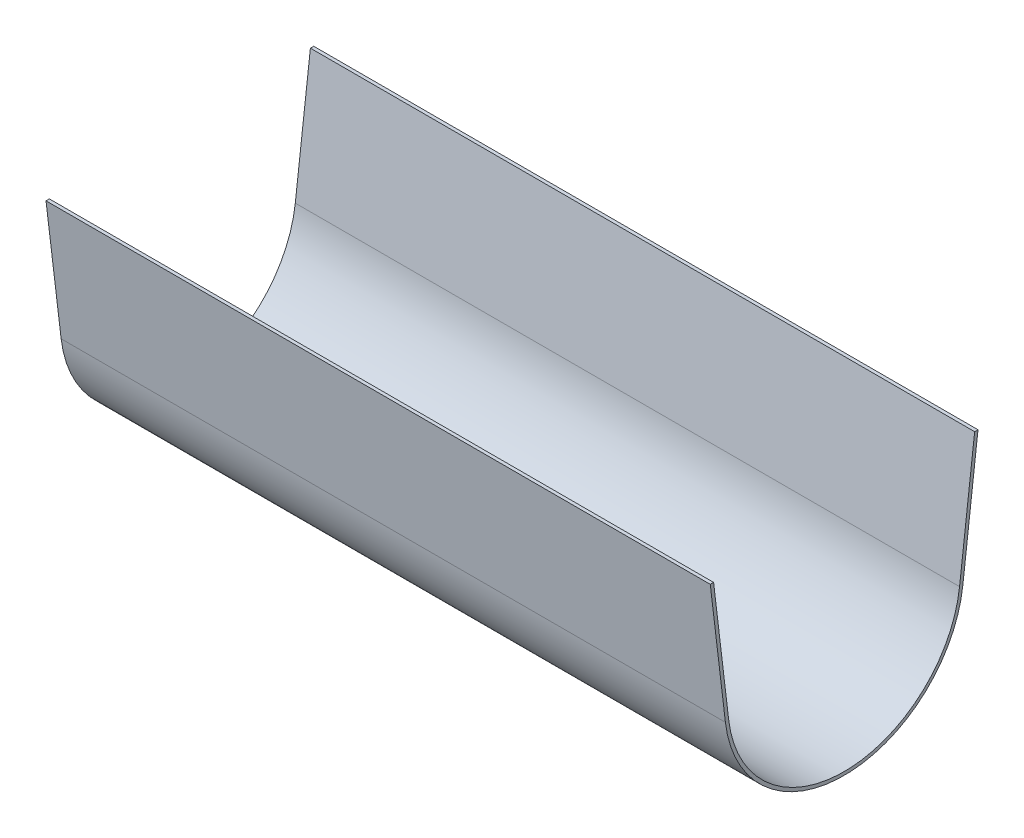
ISO-10303-21;
HEADER;
FILE_DESCRIPTION(('STEP AP214'),'2;1');
FILE_NAME('part.step','',(''),(''),'','','');
FILE_SCHEMA(('AUTOMOTIVE_DESIGN { 1 0 10303 214 1 1 1 1 }'));
ENDSEC;
DATA;
#1=APPLICATION_CONTEXT('core data for automotive mechanical design processes');
#2=APPLICATION_PROTOCOL_DEFINITION('international standard','automotive_design',2000,#1);
#3=PRODUCT_CONTEXT('',#1,'mechanical');
#4=PRODUCT('Part','Part','',(#3));
#5=PRODUCT_RELATED_PRODUCT_CATEGORY('part','',(#4));
#6=PRODUCT_DEFINITION_FORMATION('','',#4);
#7=PRODUCT_DEFINITION_CONTEXT('part definition',#1,'design');
#8=PRODUCT_DEFINITION('design','',#6,#7);
#9=PRODUCT_DEFINITION_SHAPE('','',#8);
#10=(LENGTH_UNIT() NAMED_UNIT(*) SI_UNIT(.MILLI.,.METRE.));
#11=(NAMED_UNIT(*) PLANE_ANGLE_UNIT() SI_UNIT($,.RADIAN.));
#12=(NAMED_UNIT(*) SI_UNIT($,.STERADIAN.) SOLID_ANGLE_UNIT());
#13=UNCERTAINTY_MEASURE_WITH_UNIT(LENGTH_MEASURE(1.E-05),#10,'distance_accuracy_value','');
#14=(GEOMETRIC_REPRESENTATION_CONTEXT(3) GLOBAL_UNCERTAINTY_ASSIGNED_CONTEXT((#13)) GLOBAL_UNIT_ASSIGNED_CONTEXT((#10,
#11,#12)) REPRESENTATION_CONTEXT('',''));
#15=CARTESIAN_POINT('',(0.,0.,0.));
#16=DIRECTION('',(0.,0.,1.));
#17=DIRECTION('',(1.,0.,0.));
#18=AXIS2_PLACEMENT_3D('',#15,#16,#17);
#19=CARTESIAN_POINT('',(100.,0.,-40.305));
#20=DIRECTION('',(0.,-1.,0.));
#21=DIRECTION('',(0.,0.,-1.));
#22=AXIS2_PLACEMENT_3D('',#19,#20,#21);
#23=PLANE('',#22);
#24=DIRECTION('',(0.,0.,1.));
#25=VECTOR('',#24,1.);
#26=CARTESIAN_POINT('',(-100.,0.,-40.305));
#27=LINE('',#26,#25);
#28=CARTESIAN_POINT('',(-100.,0.,-40.305));
#29=VERTEX_POINT('',#28);
#30=CARTESIAN_POINT('',(-100.,0.,-39.2979289443867));
#31=VERTEX_POINT('',#30);
#32=EDGE_CURVE('E139',#29,#31,#27,.T.);
#33=ORIENTED_EDGE('',*,*,#32,.T.);
#34=DIRECTION('',(-1.,0.,0.));
#35=VECTOR('',#34,1.);
#36=CARTESIAN_POINT('',(100.,0.,-39.2979289443867));
#37=LINE('',#36,#35);
#38=CARTESIAN_POINT('',(100.,0.,-39.2979289443867));
#39=VERTEX_POINT('',#38);
#40=EDGE_CURVE('E11',#39,#31,#37,.T.);
#41=ORIENTED_EDGE('',*,*,#40,.F.);
#42=DIRECTION('',(0.,0.,1.));
#43=VECTOR('',#42,1.);
#44=CARTESIAN_POINT('',(100.,0.,-40.305));
#45=LINE('',#44,#43);
#46=CARTESIAN_POINT('',(100.,0.,-40.305));
#47=VERTEX_POINT('',#46);
#48=EDGE_CURVE('E153',#47,#39,#45,.T.);
#49=ORIENTED_EDGE('',*,*,#48,.F.);
#50=DIRECTION('',(-1.,0.,0.));
#51=VECTOR('',#50,1.);
#52=CARTESIAN_POINT('',(100.,0.,-40.305));
#53=LINE('',#52,#51);
#54=EDGE_CURVE('E135',#47,#29,#53,.T.);
#55=ORIENTED_EDGE('',*,*,#54,.T.);
#56=EDGE_LOOP('',(#33,#41,#49,#55));
#57=FACE_BOUND('',#56,.T.);
#58=ADVANCED_FACE('F43',(#57),#23,.F.);
#59=CARTESIAN_POINT('',(100.,0.,-39.2979289443867));
#60=DIRECTION('',(0.,-0.118294182256219,-0.992978593145055));
#61=DIRECTION('',(0.,0.992978593145055,-0.118294182256219));
#62=AXIS2_PLACEMENT_3D('',#59,#60,#61);
#63=PLANE('',#62);
#64=DIRECTION('',(0.,-0.992978593145055,0.118294182256219));
#65=VECTOR('',#64,1.);
#66=CARTESIAN_POINT('',(-100.,0.,-39.2979289443867));
#67=LINE('',#66,#65);
#68=CARTESIAN_POINT('',(-100.,-38.1402963789677,-34.7542507600769));
#69=VERTEX_POINT('',#68);
#70=EDGE_CURVE('E142',#31,#69,#67,.T.);
#71=ORIENTED_EDGE('',*,*,#70,.T.);
#72=DIRECTION('',(-1.,0.,0.));
#73=VECTOR('',#72,1.);
#74=CARTESIAN_POINT('',(100.,-38.1402963789677,-34.7542507600769));
#75=LINE('',#74,#73);
#76=CARTESIAN_POINT('',(100.,-38.1402963789677,-34.7542507600769));
#77=VERTEX_POINT('',#76);
#78=EDGE_CURVE('E51',#77,#69,#75,.T.);
#79=ORIENTED_EDGE('',*,*,#78,.F.);
#80=DIRECTION('',(0.,-0.992978593145055,0.118294182256219));
#81=VECTOR('',#80,1.);
#82=CARTESIAN_POINT('',(100.,0.,-39.2979289443867));
#83=LINE('',#82,#81);
#84=EDGE_CURVE('E102',#39,#77,#83,.T.);
#85=ORIENTED_EDGE('',*,*,#84,.F.);
#86=ORIENTED_EDGE('',*,*,#40,.T.);
#87=EDGE_LOOP('',(#71,#79,#85,#86));
#88=FACE_BOUND('',#87,.T.);
#89=ADVANCED_FACE('F188',(#88),#63,.F.);
#90=CARTESIAN_POINT('',(100.,-34.,0.));
#91=DIRECTION('',(-1.,0.,0.));
#92=DIRECTION('',(0.,0.,1.));
#93=AXIS2_PLACEMENT_3D('',#90,#91,#92);
#94=CYLINDRICAL_SURFACE('',#93,35.);
#95=CARTESIAN_POINT('',(-100.,-34.,0.));
#96=DIRECTION('',(-1.,0.,0.));
#97=DIRECTION('',(0.,0.,-1.));
#98=AXIS2_PLACEMENT_3D('',#95,#96,#97);
#99=CIRCLE('',#98,35.);
#100=CARTESIAN_POINT('',(-100.,-38.1402963789677,34.7542507600769));
#101=VERTEX_POINT('',#100);
#102=EDGE_CURVE('E144',#69,#101,#99,.T.);
#103=ORIENTED_EDGE('',*,*,#102,.T.);
#104=DIRECTION('',(-1.,0.,0.));
#105=VECTOR('',#104,1.);
#106=CARTESIAN_POINT('',(100.,-38.1402963789677,34.7542507600769));
#107=LINE('',#106,#105);
#108=CARTESIAN_POINT('',(100.,-38.1402963789677,34.7542507600769));
#109=VERTEX_POINT('',#108);
#110=EDGE_CURVE('E160',#109,#101,#107,.T.);
#111=ORIENTED_EDGE('',*,*,#110,.F.);
#112=CARTESIAN_POINT('',(100.,-34.,0.));
#113=DIRECTION('',(-1.,0.,0.));
#114=DIRECTION('',(0.,0.,-1.));
#115=AXIS2_PLACEMENT_3D('',#112,#113,#114);
#116=CIRCLE('',#115,35.);
#117=EDGE_CURVE('E168',#77,#109,#116,.T.);
#118=ORIENTED_EDGE('',*,*,#117,.F.);
#119=ORIENTED_EDGE('',*,*,#78,.T.);
#120=EDGE_LOOP('',(#103,#111,#118,#119));
#121=FACE_BOUND('',#120,.T.);
#122=ADVANCED_FACE('F166',(#121),#94,.F.);
#123=CARTESIAN_POINT('',(100.,0.,39.2979289443867));
#124=DIRECTION('',(0.,-0.11829418225622,0.992978593145055));
#125=DIRECTION('',(0.,-0.992978593145055,-0.11829418225622));
#126=AXIS2_PLACEMENT_3D('',#123,#124,#125);
#127=PLANE('',#126);
#128=DIRECTION('',(0.,0.992978593145055,0.11829418225622));
#129=VECTOR('',#128,1.);
#130=CARTESIAN_POINT('',(-100.,0.,39.2979289443867));
#131=LINE('',#130,#129);
#132=CARTESIAN_POINT('',(-100.,0.,39.2979289443867));
#133=VERTEX_POINT('',#132);
#134=EDGE_CURVE('E146',#101,#133,#131,.T.);
#135=ORIENTED_EDGE('',*,*,#134,.T.);
#136=DIRECTION('',(-1.,0.,0.));
#137=VECTOR('',#136,1.);
#138=CARTESIAN_POINT('',(100.,0.,39.2979289443867));
#139=LINE('',#138,#137);
#140=CARTESIAN_POINT('',(100.,0.,39.2979289443867));
#141=VERTEX_POINT('',#140);
#142=EDGE_CURVE('E157',#141,#133,#139,.T.);
#143=ORIENTED_EDGE('',*,*,#142,.F.);
#144=DIRECTION('',(0.,0.992978593145055,0.11829418225622));
#145=VECTOR('',#144,1.);
#146=CARTESIAN_POINT('',(100.,0.,39.2979289443867));
#147=LINE('',#146,#145);
#148=EDGE_CURVE('E180',#109,#141,#147,.T.);
#149=ORIENTED_EDGE('',*,*,#148,.F.);
#150=ORIENTED_EDGE('',*,*,#110,.T.);
#151=EDGE_LOOP('',(#135,#143,#149,#150));
#152=FACE_BOUND('',#151,.T.);
#153=ADVANCED_FACE('F176',(#152),#127,.F.);
#154=CARTESIAN_POINT('',(100.,0.,40.305));
#155=DIRECTION('',(0.,-1.,0.));
#156=DIRECTION('',(0.,0.,-1.));
#157=AXIS2_PLACEMENT_3D('',#154,#155,#156);
#158=PLANE('',#157);
#159=DIRECTION('',(0.,0.,1.));
#160=VECTOR('',#159,1.);
#161=CARTESIAN_POINT('',(-100.,0.,40.305));
#162=LINE('',#161,#160);
#163=CARTESIAN_POINT('',(-100.,0.,40.305));
#164=VERTEX_POINT('',#163);
#165=EDGE_CURVE('E148',#133,#164,#162,.T.);
#166=ORIENTED_EDGE('',*,*,#165,.T.);
#167=DIRECTION('',(-1.,0.,0.));
#168=VECTOR('',#167,1.);
#169=CARTESIAN_POINT('',(100.,0.,40.305));
#170=LINE('',#169,#168);
#171=CARTESIAN_POINT('',(100.,0.,40.305));
#172=VERTEX_POINT('',#171);
#173=EDGE_CURVE('E130',#172,#164,#170,.T.);
#174=ORIENTED_EDGE('',*,*,#173,.F.);
#175=DIRECTION('',(0.,0.,1.));
#176=VECTOR('',#175,1.);
#177=CARTESIAN_POINT('',(100.,0.,40.305));
#178=LINE('',#177,#176);
#179=EDGE_CURVE('E121',#141,#172,#178,.T.);
#180=ORIENTED_EDGE('',*,*,#179,.F.);
#181=ORIENTED_EDGE('',*,*,#142,.T.);
#182=EDGE_LOOP('',(#166,#174,#180,#181));
#183=FACE_BOUND('',#182,.T.);
#184=ADVANCED_FACE('F179',(#183),#158,.F.);
#185=CARTESIAN_POINT('',(100.,0.,40.305));
#186=DIRECTION('',(0.,0.118294182256219,-0.992978593145055));
#187=DIRECTION('',(0.,0.992978593145055,0.118294182256219));
#188=AXIS2_PLACEMENT_3D('',#185,#186,#187);
#189=PLANE('',#188);
#190=DIRECTION('',(0.,-0.992978593145055,-0.118294182256219));
#191=VECTOR('',#190,1.);
#192=CARTESIAN_POINT('',(-100.,0.,40.305));
#193=LINE('',#192,#191);
#194=CARTESIAN_POINT('',(-100.,-38.2585905612239,35.747229353222));
#195=VERTEX_POINT('',#194);
#196=EDGE_CURVE('E129',#164,#195,#193,.T.);
#197=ORIENTED_EDGE('',*,*,#196,.T.);
#198=DIRECTION('',(-1.,0.,0.));
#199=VECTOR('',#198,1.);
#200=CARTESIAN_POINT('',(100.,-38.2585905612239,35.747229353222));
#201=LINE('',#200,#199);
#202=CARTESIAN_POINT('',(100.,-38.2585905612239,35.747229353222));
#203=VERTEX_POINT('',#202);
#204=EDGE_CURVE('E126',#203,#195,#201,.T.);
#205=ORIENTED_EDGE('',*,*,#204,.F.);
#206=DIRECTION('',(0.,-0.992978593145055,-0.118294182256219));
#207=VECTOR('',#206,1.);
#208=CARTESIAN_POINT('',(100.,0.,40.305));
#209=LINE('',#208,#207);
#210=EDGE_CURVE('E115',#172,#203,#209,.T.);
#211=ORIENTED_EDGE('',*,*,#210,.F.);
#212=ORIENTED_EDGE('',*,*,#173,.T.);
#213=EDGE_LOOP('',(#197,#205,#211,#212));
#214=FACE_BOUND('',#213,.T.);
#215=ADVANCED_FACE('F127',(#214),#189,.F.);
#216=CARTESIAN_POINT('',(100.,-34.,0.));
#217=DIRECTION('',(-1.,0.,0.));
#218=DIRECTION('',(0.,0.,1.));
#219=AXIS2_PLACEMENT_3D('',#216,#217,#218);
#220=CYLINDRICAL_SURFACE('',#219,36.);
#221=CARTESIAN_POINT('',(-100.,-34.,0.));
#222=DIRECTION('',(1.,0.,0.));
#223=DIRECTION('',(0.,0.,-1.));
#224=AXIS2_PLACEMENT_3D('',#221,#222,#223);
#225=CIRCLE('',#224,36.);
#226=CARTESIAN_POINT('',(-100.,-38.2585905612239,-35.747229353222));
#227=VERTEX_POINT('',#226);
#228=EDGE_CURVE('E88',#195,#227,#225,.T.);
#229=ORIENTED_EDGE('',*,*,#228,.T.);
#230=DIRECTION('',(-1.,0.,0.));
#231=VECTOR('',#230,1.);
#232=CARTESIAN_POINT('',(100.,-38.2585905612239,-35.747229353222));
#233=LINE('',#232,#231);
#234=CARTESIAN_POINT('',(100.,-38.2585905612239,-35.747229353222));
#235=VERTEX_POINT('',#234);
#236=EDGE_CURVE('E131',#235,#227,#233,.T.);
#237=ORIENTED_EDGE('',*,*,#236,.F.);
#238=CARTESIAN_POINT('',(100.,-34.,0.));
#239=DIRECTION('',(1.,0.,0.));
#240=DIRECTION('',(0.,0.,-1.));
#241=AXIS2_PLACEMENT_3D('',#238,#239,#240);
#242=CIRCLE('',#241,36.);
#243=EDGE_CURVE('E119',#203,#235,#242,.T.);
#244=ORIENTED_EDGE('',*,*,#243,.F.);
#245=ORIENTED_EDGE('',*,*,#204,.T.);
#246=EDGE_LOOP('',(#229,#237,#244,#245));
#247=FACE_BOUND('',#246,.T.);
#248=ADVANCED_FACE('F133',(#247),#220,.T.);
#249=CARTESIAN_POINT('',(100.,0.,-40.305));
#250=DIRECTION('',(0.,0.118294182256219,0.992978593145055));
#251=DIRECTION('',(0.,-0.992978593145055,0.118294182256219));
#252=AXIS2_PLACEMENT_3D('',#249,#250,#251);
#253=PLANE('',#252);
#254=DIRECTION('',(0.,0.992978593145055,-0.118294182256219));
#255=VECTOR('',#254,1.);
#256=CARTESIAN_POINT('',(-100.,0.,-40.305));
#257=LINE('',#256,#255);
#258=EDGE_CURVE('E94',#227,#29,#257,.T.);
#259=ORIENTED_EDGE('',*,*,#258,.T.);
#260=ORIENTED_EDGE('',*,*,#54,.F.);
#261=DIRECTION('',(0.,0.992978593145055,-0.118294182256219));
#262=VECTOR('',#261,1.);
#263=CARTESIAN_POINT('',(100.,0.,-40.305));
#264=LINE('',#263,#262);
#265=EDGE_CURVE('E59',#235,#47,#264,.T.);
#266=ORIENTED_EDGE('',*,*,#265,.F.);
#267=ORIENTED_EDGE('',*,*,#236,.T.);
#268=EDGE_LOOP('',(#259,#260,#266,#267));
#269=FACE_BOUND('',#268,.T.);
#270=ADVANCED_FACE('F204',(#269),#253,.F.);
#271=CARTESIAN_POINT('',(100.,-34.,0.));
#272=DIRECTION('',(1.,0.,0.));
#273=DIRECTION('',(0.,0.,-1.));
#274=AXIS2_PLACEMENT_3D('',#271,#272,#273);
#275=PLANE('',#274);
#276=ORIENTED_EDGE('',*,*,#48,.T.);
#277=ORIENTED_EDGE('',*,*,#84,.T.);
#278=ORIENTED_EDGE('',*,*,#117,.T.);
#279=ORIENTED_EDGE('',*,*,#148,.T.);
#280=ORIENTED_EDGE('',*,*,#179,.T.);
#281=ORIENTED_EDGE('',*,*,#210,.T.);
#282=ORIENTED_EDGE('',*,*,#243,.T.);
#283=ORIENTED_EDGE('',*,*,#265,.T.);
#284=EDGE_LOOP('',(#276,#277,#278,#279,#280,#281,#282,#283));
#285=FACE_BOUND('',#284,.T.);
#286=ADVANCED_FACE('F117',(#285),#275,.T.);
#287=CARTESIAN_POINT('',(-100.,-34.,0.));
#288=DIRECTION('',(1.,0.,0.));
#289=DIRECTION('',(0.,0.,-1.));
#290=AXIS2_PLACEMENT_3D('',#287,#288,#289);
#291=PLANE('',#290);
#292=ORIENTED_EDGE('',*,*,#32,.F.);
#293=ORIENTED_EDGE('',*,*,#258,.F.);
#294=ORIENTED_EDGE('',*,*,#228,.F.);
#295=ORIENTED_EDGE('',*,*,#196,.F.);
#296=ORIENTED_EDGE('',*,*,#165,.F.);
#297=ORIENTED_EDGE('',*,*,#134,.F.);
#298=ORIENTED_EDGE('',*,*,#102,.F.);
#299=ORIENTED_EDGE('',*,*,#70,.F.);
#300=EDGE_LOOP('',(#292,#293,#294,#295,#296,#297,#298,#299));
#301=FACE_BOUND('',#300,.T.);
#302=ADVANCED_FACE('F172',(#301),#291,.F.);
#303=CLOSED_SHELL('',(#58,#89,#122,#153,#184,#215,#248,#270,#286,#302));
#304=MANIFOLD_SOLID_BREP('B2',#303);
#305=ADVANCED_BREP_SHAPE_REPRESENTATION('',(#18,#304),#14);
#306=SHAPE_DEFINITION_REPRESENTATION(#9,#305);
ENDSEC;
END-ISO-10303-21;
